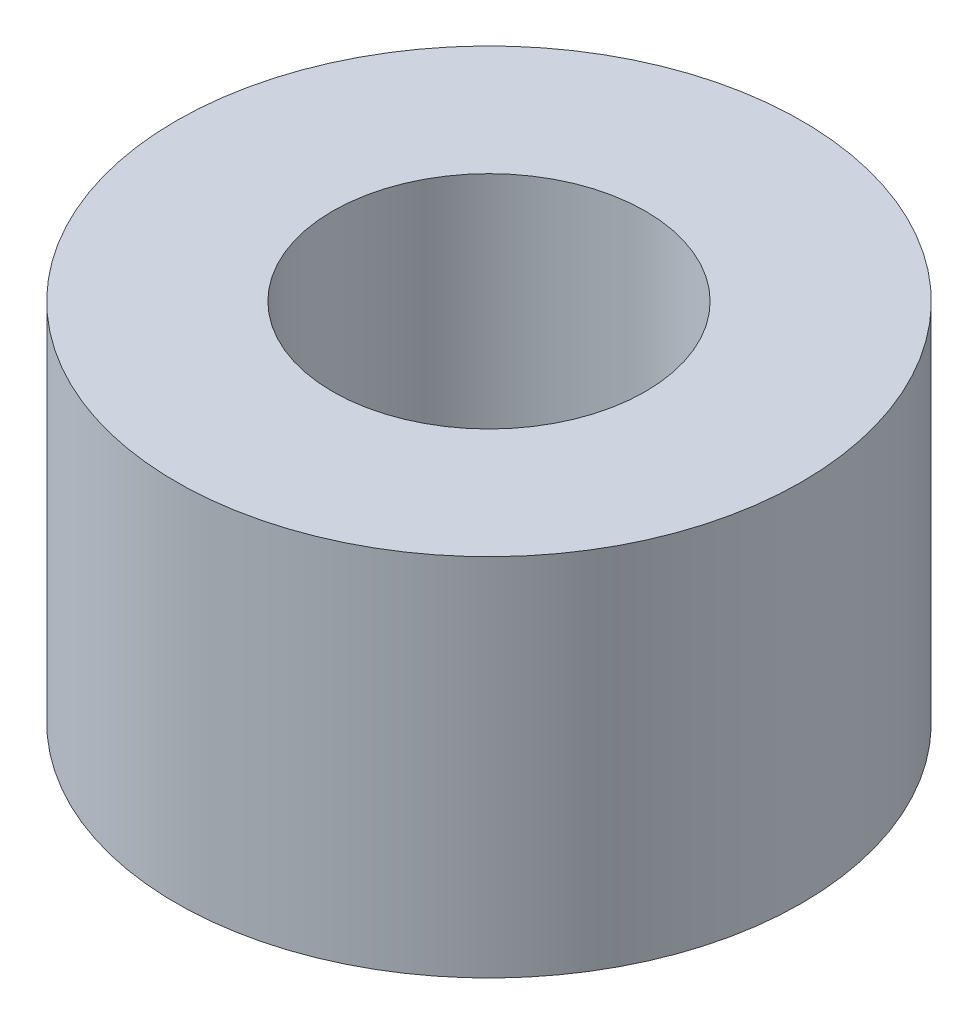
ISO-10303-21;
HEADER;
FILE_DESCRIPTION(('STEP AP214'),'2;1');
FILE_NAME('part.step','',(''),(''),'','','');
FILE_SCHEMA(('AUTOMOTIVE_DESIGN { 1 0 10303 214 1 1 1 1 }'));
ENDSEC;
DATA;
#1=APPLICATION_CONTEXT('core data for automotive mechanical design processes');
#2=APPLICATION_PROTOCOL_DEFINITION('international standard','automotive_design',2000,#1);
#3=PRODUCT_CONTEXT('',#1,'mechanical');
#4=PRODUCT('Part','Part','',(#3));
#5=PRODUCT_RELATED_PRODUCT_CATEGORY('part','',(#4));
#6=PRODUCT_DEFINITION_FORMATION('','',#4);
#7=PRODUCT_DEFINITION_CONTEXT('part definition',#1,'design');
#8=PRODUCT_DEFINITION('design','',#6,#7);
#9=PRODUCT_DEFINITION_SHAPE('','',#8);
#10=(LENGTH_UNIT() NAMED_UNIT(*) SI_UNIT(.MILLI.,.METRE.));
#11=(NAMED_UNIT(*) PLANE_ANGLE_UNIT() SI_UNIT($,.RADIAN.));
#12=(NAMED_UNIT(*) SI_UNIT($,.STERADIAN.) SOLID_ANGLE_UNIT());
#13=UNCERTAINTY_MEASURE_WITH_UNIT(LENGTH_MEASURE(1.E-05),#10,'distance_accuracy_value','');
#14=(GEOMETRIC_REPRESENTATION_CONTEXT(3) GLOBAL_UNCERTAINTY_ASSIGNED_CONTEXT((#13)) GLOBAL_UNIT_ASSIGNED_CONTEXT((#10,
#11,#12)) REPRESENTATION_CONTEXT('',''));
#15=CARTESIAN_POINT('',(0.,0.,0.));
#16=DIRECTION('',(0.,0.,1.));
#17=DIRECTION('',(1.,0.,0.));
#18=AXIS2_PLACEMENT_3D('',#15,#16,#17);
#19=CARTESIAN_POINT('',(0.,7.,0.));
#20=DIRECTION('',(0.,1.,0.));
#21=DIRECTION('',(0.,0.,1.));
#22=AXIS2_PLACEMENT_3D('',#19,#20,#21);
#23=PLANE('',#22);
#24=CARTESIAN_POINT('',(0.,7.,0.));
#25=DIRECTION('',(0.,1.,0.));
#26=DIRECTION('',(1.,0.,0.));
#27=AXIS2_PLACEMENT_3D('',#24,#25,#26);
#28=CIRCLE('',#27,6.);
#29=CARTESIAN_POINT('',(6.,7.,0.));
#30=VERTEX_POINT('',#29);
#31=EDGE_CURVE('E11',#30,#30,#28,.T.);
#32=ORIENTED_EDGE('',*,*,#31,.T.);
#33=EDGE_LOOP('',(#32));
#34=FACE_BOUND('',#33,.T.);
#35=CARTESIAN_POINT('',(0.,7.,0.));
#36=DIRECTION('',(0.,1.,0.));
#37=DIRECTION('',(0.,0.,1.));
#38=AXIS2_PLACEMENT_3D('',#35,#36,#37);
#39=CIRCLE('',#38,3.);
#40=CARTESIAN_POINT('',(0.,7.,3.));
#41=VERTEX_POINT('',#40);
#42=EDGE_CURVE('E57',#41,#41,#39,.T.);
#43=ORIENTED_EDGE('',*,*,#42,.F.);
#44=EDGE_LOOP('',(#43));
#45=FACE_BOUND('',#44,.T.);
#46=ADVANCED_FACE('F43',(#34,#45),#23,.T.);
#47=CARTESIAN_POINT('',(0.,0.,0.));
#48=DIRECTION('',(0.,1.,0.));
#49=DIRECTION('',(0.,0.,1.));
#50=AXIS2_PLACEMENT_3D('',#47,#48,#49);
#51=PLANE('',#50);
#52=CARTESIAN_POINT('',(0.,0.,0.));
#53=DIRECTION('',(0.,1.,0.));
#54=DIRECTION('',(1.,0.,0.));
#55=AXIS2_PLACEMENT_3D('',#52,#53,#54);
#56=CIRCLE('',#55,6.);
#57=CARTESIAN_POINT('',(6.,0.,0.));
#58=VERTEX_POINT('',#57);
#59=EDGE_CURVE('E47',#58,#58,#56,.T.);
#60=ORIENTED_EDGE('',*,*,#59,.F.);
#61=EDGE_LOOP('',(#60));
#62=FACE_BOUND('',#61,.T.);
#63=CARTESIAN_POINT('',(0.,0.,0.));
#64=DIRECTION('',(0.,1.,0.));
#65=DIRECTION('',(0.,0.,1.));
#66=AXIS2_PLACEMENT_3D('',#63,#64,#65);
#67=CIRCLE('',#66,3.);
#68=CARTESIAN_POINT('',(0.,0.,3.));
#69=VERTEX_POINT('',#68);
#70=EDGE_CURVE('E59',#69,#69,#67,.T.);
#71=ORIENTED_EDGE('',*,*,#70,.T.);
#72=EDGE_LOOP('',(#71));
#73=FACE_BOUND('',#72,.T.);
#74=ADVANCED_FACE('F72',(#62,#73),#51,.F.);
#75=CARTESIAN_POINT('',(0.,7.,0.));
#76=DIRECTION('',(0.,-1.,0.));
#77=DIRECTION('',(0.,0.,-1.));
#78=AXIS2_PLACEMENT_3D('',#75,#76,#77);
#79=CYLINDRICAL_SURFACE('',#78,6.);
#80=ORIENTED_EDGE('',*,*,#31,.F.);
#81=EDGE_LOOP('',(#80));
#82=FACE_BOUND('',#81,.T.);
#83=ORIENTED_EDGE('',*,*,#59,.T.);
#84=EDGE_LOOP('',(#83));
#85=FACE_BOUND('',#84,.T.);
#86=ADVANCED_FACE('F45',(#82,#85),#79,.T.);
#87=CARTESIAN_POINT('',(0.,7.,0.));
#88=DIRECTION('',(0.,-1.,0.));
#89=DIRECTION('',(0.,0.,-1.));
#90=AXIS2_PLACEMENT_3D('',#87,#88,#89);
#91=CYLINDRICAL_SURFACE('',#90,3.);
#92=ORIENTED_EDGE('',*,*,#42,.T.);
#93=EDGE_LOOP('',(#92));
#94=FACE_BOUND('',#93,.T.);
#95=ORIENTED_EDGE('',*,*,#70,.F.);
#96=EDGE_LOOP('',(#95));
#97=FACE_BOUND('',#96,.T.);
#98=ADVANCED_FACE('F68',(#94,#97),#91,.F.);
#99=CLOSED_SHELL('',(#46,#74,#86,#98));
#100=MANIFOLD_SOLID_BREP('B2',#99);
#101=ADVANCED_BREP_SHAPE_REPRESENTATION('',(#18,#100),#14);
#102=SHAPE_DEFINITION_REPRESENTATION(#9,#101);
ENDSEC;
END-ISO-10303-21;
